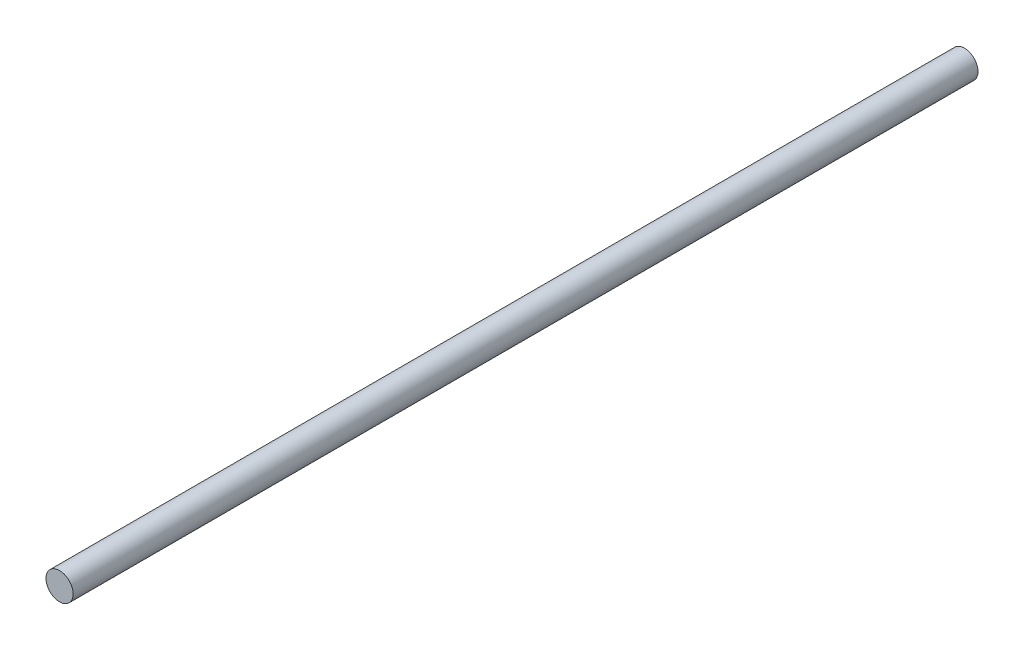
ISO-10303-21;
HEADER;
FILE_DESCRIPTION(('STEP AP214'),'2;1');
FILE_NAME('part.step','',(''),(''),'','','');
FILE_SCHEMA(('AUTOMOTIVE_DESIGN { 1 0 10303 214 1 1 1 1 }'));
ENDSEC;
DATA;
#1=APPLICATION_CONTEXT('core data for automotive mechanical design processes');
#2=APPLICATION_PROTOCOL_DEFINITION('international standard','automotive_design',2000,#1);
#3=PRODUCT_CONTEXT('',#1,'mechanical');
#4=PRODUCT('Part','Part','',(#3));
#5=PRODUCT_RELATED_PRODUCT_CATEGORY('part','',(#4));
#6=PRODUCT_DEFINITION_FORMATION('','',#4);
#7=PRODUCT_DEFINITION_CONTEXT('part definition',#1,'design');
#8=PRODUCT_DEFINITION('design','',#6,#7);
#9=PRODUCT_DEFINITION_SHAPE('','',#8);
#10=(LENGTH_UNIT() NAMED_UNIT(*) SI_UNIT(.MILLI.,.METRE.));
#11=(NAMED_UNIT(*) PLANE_ANGLE_UNIT() SI_UNIT($,.RADIAN.));
#12=(NAMED_UNIT(*) SI_UNIT($,.STERADIAN.) SOLID_ANGLE_UNIT());
#13=UNCERTAINTY_MEASURE_WITH_UNIT(LENGTH_MEASURE(1.E-05),#10,'distance_accuracy_value','');
#14=(GEOMETRIC_REPRESENTATION_CONTEXT(3) GLOBAL_UNCERTAINTY_ASSIGNED_CONTEXT((#13)) GLOBAL_UNIT_ASSIGNED_CONTEXT((#10,
#11,#12)) REPRESENTATION_CONTEXT('',''));
#15=CARTESIAN_POINT('',(0.,0.,0.));
#16=DIRECTION('',(0.,0.,1.));
#17=DIRECTION('',(1.,0.,0.));
#18=AXIS2_PLACEMENT_3D('',#15,#16,#17);
#19=CARTESIAN_POINT('',(0.,0.645644178881028,-100.));
#20=DIRECTION('',(0.,0.,1.));
#21=DIRECTION('',(1.,0.,0.));
#22=AXIS2_PLACEMENT_3D('',#19,#20,#21);
#23=CYLINDRICAL_SURFACE('',#22,3.);
#24=CARTESIAN_POINT('',(0.,0.645644178881028,-100.));
#25=DIRECTION('',(0.,0.,1.));
#26=DIRECTION('',(1.,0.,0.));
#27=AXIS2_PLACEMENT_3D('',#24,#25,#26);
#28=CIRCLE('',#27,3.);
#29=CARTESIAN_POINT('',(3.,0.645644178881028,-100.));
#30=VERTEX_POINT('',#29);
#31=EDGE_CURVE('E10',#30,#30,#28,.T.);
#32=ORIENTED_EDGE('',*,*,#31,.T.);
#33=EDGE_LOOP('',(#32));
#34=FACE_BOUND('',#33,.T.);
#35=CARTESIAN_POINT('',(0.,0.645644178881028,100.));
#36=DIRECTION('',(0.,0.,1.));
#37=DIRECTION('',(1.,0.,0.));
#38=AXIS2_PLACEMENT_3D('',#35,#36,#37);
#39=CIRCLE('',#38,3.);
#40=CARTESIAN_POINT('',(3.,0.645644178881028,100.));
#41=VERTEX_POINT('',#40);
#42=EDGE_CURVE('E43',#41,#41,#39,.T.);
#43=ORIENTED_EDGE('',*,*,#42,.F.);
#44=EDGE_LOOP('',(#43));
#45=FACE_BOUND('',#44,.T.);
#46=ADVANCED_FACE('F40',(#34,#45),#23,.T.);
#47=CARTESIAN_POINT('',(0.,0.645644178881028,-100.));
#48=DIRECTION('',(0.,0.,1.));
#49=DIRECTION('',(1.,0.,0.));
#50=AXIS2_PLACEMENT_3D('',#47,#48,#49);
#51=PLANE('',#50);
#52=ORIENTED_EDGE('',*,*,#31,.F.);
#53=EDGE_LOOP('',(#52));
#54=FACE_BOUND('',#53,.T.);
#55=ADVANCED_FACE('F55',(#54),#51,.F.);
#56=CARTESIAN_POINT('',(0.,0.645644178881028,100.));
#57=DIRECTION('',(0.,0.,1.));
#58=DIRECTION('',(1.,0.,0.));
#59=AXIS2_PLACEMENT_3D('',#56,#57,#58);
#60=PLANE('',#59);
#61=ORIENTED_EDGE('',*,*,#42,.T.);
#62=EDGE_LOOP('',(#61));
#63=FACE_BOUND('',#62,.T.);
#64=ADVANCED_FACE('F47',(#63),#60,.T.);
#65=CLOSED_SHELL('',(#46,#55,#64));
#66=MANIFOLD_SOLID_BREP('B2',#65);
#67=ADVANCED_BREP_SHAPE_REPRESENTATION('',(#18,#66),#14);
#68=SHAPE_DEFINITION_REPRESENTATION(#9,#67);
ENDSEC;
END-ISO-10303-21;
